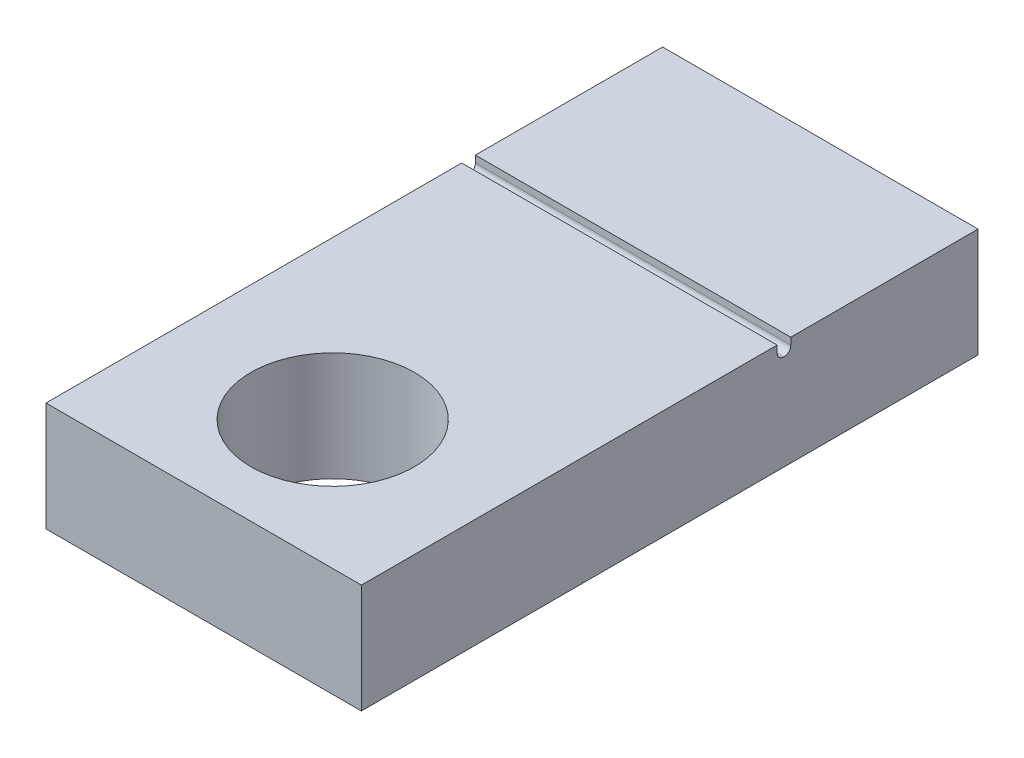
ISO-10303-21;
HEADER;
FILE_DESCRIPTION(('STEP AP214'),'2;1');
FILE_NAME('part.step','',(''),(''),'','','');
FILE_SCHEMA(('AUTOMOTIVE_DESIGN { 1 0 10303 214 1 1 1 1 }'));
ENDSEC;
DATA;
#1=APPLICATION_CONTEXT('core data for automotive mechanical design processes');
#2=APPLICATION_PROTOCOL_DEFINITION('international standard','automotive_design',2000,#1);
#3=PRODUCT_CONTEXT('',#1,'mechanical');
#4=PRODUCT('Part','Part','',(#3));
#5=PRODUCT_RELATED_PRODUCT_CATEGORY('part','',(#4));
#6=PRODUCT_DEFINITION_FORMATION('','',#4);
#7=PRODUCT_DEFINITION_CONTEXT('part definition',#1,'design');
#8=PRODUCT_DEFINITION('design','',#6,#7);
#9=PRODUCT_DEFINITION_SHAPE('','',#8);
#10=(LENGTH_UNIT() NAMED_UNIT(*) SI_UNIT(.MILLI.,.METRE.));
#11=(NAMED_UNIT(*) PLANE_ANGLE_UNIT() SI_UNIT($,.RADIAN.));
#12=(NAMED_UNIT(*) SI_UNIT($,.STERADIAN.) SOLID_ANGLE_UNIT());
#13=UNCERTAINTY_MEASURE_WITH_UNIT(LENGTH_MEASURE(1.E-05),#10,'distance_accuracy_value','');
#14=(GEOMETRIC_REPRESENTATION_CONTEXT(3) GLOBAL_UNCERTAINTY_ASSIGNED_CONTEXT((#13)) GLOBAL_UNIT_ASSIGNED_CONTEXT((#10,
#11,#12)) REPRESENTATION_CONTEXT('',''));
#15=CARTESIAN_POINT('',(0.,0.,0.));
#16=DIRECTION('',(0.,0.,1.));
#17=DIRECTION('',(1.,0.,0.));
#18=AXIS2_PLACEMENT_3D('',#15,#16,#17);
#19=CARTESIAN_POINT('',(0.,8.,0.));
#20=DIRECTION('',(0.,1.,0.));
#21=DIRECTION('',(0.,0.,1.));
#22=AXIS2_PLACEMENT_3D('',#19,#20,#21);
#23=PLANE('',#22);
#24=DIRECTION('',(1.,0.,0.));
#25=VECTOR('',#24,1.);
#26=CARTESIAN_POINT('',(0.,8.,-13.0361684561709));
#27=LINE('',#26,#25);
#28=CARTESIAN_POINT('',(-11.5687228073918,8.,-13.0361684561709));
#29=VERTEX_POINT('',#28);
#30=CARTESIAN_POINT('',(11.5687228073918,8.,-13.0361684561709));
#31=VERTEX_POINT('',#30);
#32=EDGE_CURVE('E117',#29,#31,#27,.T.);
#33=ORIENTED_EDGE('',*,*,#32,.F.);
#34=DIRECTION('',(0.,0.,1.));
#35=VECTOR('',#34,1.);
#36=CARTESIAN_POINT('',(-11.5687228073918,8.,0.));
#37=LINE('',#36,#35);
#38=CARTESIAN_POINT('',(-11.5687228073918,8.,17.4647043689874));
#39=VERTEX_POINT('',#38);
#40=EDGE_CURVE('E188',#29,#39,#37,.T.);
#41=ORIENTED_EDGE('',*,*,#40,.T.);
#42=DIRECTION('',(1.,0.,0.));
#43=VECTOR('',#42,1.);
#44=CARTESIAN_POINT('',(0.,8.,17.4647043689874));
#45=LINE('',#44,#43);
#46=CARTESIAN_POINT('',(11.5687228073918,8.,17.4647043689874));
#47=VERTEX_POINT('',#46);
#48=EDGE_CURVE('E136',#39,#47,#45,.T.);
#49=ORIENTED_EDGE('',*,*,#48,.T.);
#50=DIRECTION('',(0.,0.,1.));
#51=VECTOR('',#50,1.);
#52=CARTESIAN_POINT('',(11.5687228073918,8.,0.));
#53=LINE('',#52,#51);
#54=EDGE_CURVE('E130',#31,#47,#53,.T.);
#55=ORIENTED_EDGE('',*,*,#54,.F.);
#56=EDGE_LOOP('',(#33,#41,#49,#55));
#57=FACE_BOUND('',#56,.T.);
#58=CARTESIAN_POINT('',(0.,8.,8.00235768739895));
#59=DIRECTION('',(0.,1.,0.));
#60=DIRECTION('',(0.,0.,1.));
#61=AXIS2_PLACEMENT_3D('',#58,#59,#60);
#62=CIRCLE('',#61,5.99999999999993);
#63=CARTESIAN_POINT('',(0.,8.,14.0023576873989));
#64=VERTEX_POINT('',#63);
#65=EDGE_CURVE('E159',#64,#64,#62,.T.);
#66=ORIENTED_EDGE('',*,*,#65,.F.);
#67=EDGE_LOOP('',(#66));
#68=FACE_BOUND('',#67,.T.);
#69=ADVANCED_FACE('F46',(#57,#68),#23,.T.);
#70=CARTESIAN_POINT('',(-11.5687228073918,8.,0.));
#71=DIRECTION('',(1.,0.,0.));
#72=DIRECTION('',(0.,0.,-1.));
#73=AXIS2_PLACEMENT_3D('',#70,#71,#72);
#74=PLANE('',#73);
#75=ORIENTED_EDGE('',*,*,#40,.F.);
#76=DIRECTION('',(0.,-1.,0.));
#77=VECTOR('',#76,1.);
#78=CARTESIAN_POINT('',(-11.5687228073918,8.,-13.0361684561709));
#79=LINE('',#78,#77);
#80=CARTESIAN_POINT('',(-11.5687228073918,7.5,-13.0361684561709));
#81=VERTEX_POINT('',#80);
#82=EDGE_CURVE('E122',#29,#81,#79,.T.);
#83=ORIENTED_EDGE('',*,*,#82,.T.);
#84=CARTESIAN_POINT('',(-11.5687228073918,7.5,-13.5361684561709));
#85=DIRECTION('',(1.,0.,0.));
#86=DIRECTION('',(0.,0.,-1.));
#87=AXIS2_PLACEMENT_3D('',#84,#85,#86);
#88=CIRCLE('',#87,0.5);
#89=CARTESIAN_POINT('',(-11.5687228073918,7.,-13.5361684561709));
#90=VERTEX_POINT('',#89);
#91=EDGE_CURVE('E13',#81,#90,#88,.T.);
#92=ORIENTED_EDGE('',*,*,#91,.T.);
#93=CARTESIAN_POINT('',(-11.5687228073918,7.5,-13.5361684561709));
#94=DIRECTION('',(1.,0.,0.));
#95=DIRECTION('',(0.,0.,-1.));
#96=AXIS2_PLACEMENT_3D('',#93,#94,#95);
#97=CIRCLE('',#96,0.5);
#98=CARTESIAN_POINT('',(-11.5687228073918,7.5,-14.0361684561709));
#99=VERTEX_POINT('',#98);
#100=EDGE_CURVE('E171',#90,#99,#97,.T.);
#101=ORIENTED_EDGE('',*,*,#100,.T.);
#102=DIRECTION('',(0.,1.,0.));
#103=VECTOR('',#102,1.);
#104=CARTESIAN_POINT('',(-11.5687228073918,8.,-14.0361684561709));
#105=LINE('',#104,#103);
#106=CARTESIAN_POINT('',(-11.5687228073918,8.,-14.0361684561709));
#107=VERTEX_POINT('',#106);
#108=EDGE_CURVE('E176',#99,#107,#105,.T.);
#109=ORIENTED_EDGE('',*,*,#108,.T.);
#110=CARTESIAN_POINT('',(-11.5687228073918,8.,-27.7714433138588));
#111=VERTEX_POINT('',#110);
#112=EDGE_CURVE('E142',#111,#107,#37,.T.);
#113=ORIENTED_EDGE('',*,*,#112,.F.);
#114=DIRECTION('',(0.,-1.,0.));
#115=VECTOR('',#114,1.);
#116=CARTESIAN_POINT('',(-11.5687228073918,8.,-27.7714433138588));
#117=LINE('',#116,#115);
#118=CARTESIAN_POINT('',(-11.5687228073918,0.,-27.7714433138588));
#119=VERTEX_POINT('',#118);
#120=EDGE_CURVE('E197',#111,#119,#117,.T.);
#121=ORIENTED_EDGE('',*,*,#120,.T.);
#122=DIRECTION('',(0.,0.,1.));
#123=VECTOR('',#122,1.);
#124=CARTESIAN_POINT('',(-11.5687228073918,0.,0.));
#125=LINE('',#124,#123);
#126=CARTESIAN_POINT('',(-11.5687228073918,0.,17.4647043689874));
#127=VERTEX_POINT('',#126);
#128=EDGE_CURVE('E149',#119,#127,#125,.T.);
#129=ORIENTED_EDGE('',*,*,#128,.T.);
#130=DIRECTION('',(0.,-1.,0.));
#131=VECTOR('',#130,1.);
#132=CARTESIAN_POINT('',(-11.5687228073918,8.,17.4647043689874));
#133=LINE('',#132,#131);
#134=EDGE_CURVE('E161',#39,#127,#133,.T.);
#135=ORIENTED_EDGE('',*,*,#134,.F.);
#136=EDGE_LOOP('',(#75,#83,#92,#101,#109,#113,#121,#129,#135));
#137=FACE_BOUND('',#136,.T.);
#138=ADVANCED_FACE('F175',(#137),#74,.F.);
#139=CARTESIAN_POINT('',(0.,8.,17.4647043689874));
#140=DIRECTION('',(0.,0.,-1.));
#141=DIRECTION('',(-1.,0.,0.));
#142=AXIS2_PLACEMENT_3D('',#139,#140,#141);
#143=PLANE('',#142);
#144=DIRECTION('',(1.,0.,0.));
#145=VECTOR('',#144,1.);
#146=CARTESIAN_POINT('',(0.,0.,17.4647043689874));
#147=LINE('',#146,#145);
#148=CARTESIAN_POINT('',(11.5687228073918,0.,17.4647043689874));
#149=VERTEX_POINT('',#148);
#150=EDGE_CURVE('E153',#127,#149,#147,.T.);
#151=ORIENTED_EDGE('',*,*,#150,.T.);
#152=DIRECTION('',(0.,-1.,0.));
#153=VECTOR('',#152,1.);
#154=CARTESIAN_POINT('',(11.5687228073918,8.,17.4647043689874));
#155=LINE('',#154,#153);
#156=EDGE_CURVE('E141',#47,#149,#155,.T.);
#157=ORIENTED_EDGE('',*,*,#156,.F.);
#158=ORIENTED_EDGE('',*,*,#48,.F.);
#159=ORIENTED_EDGE('',*,*,#134,.T.);
#160=EDGE_LOOP('',(#151,#157,#158,#159));
#161=FACE_BOUND('',#160,.T.);
#162=ADVANCED_FACE('F207',(#161),#143,.F.);
#163=CARTESIAN_POINT('',(0.,8.,8.00235768739895));
#164=DIRECTION('',(0.,-1.,0.));
#165=DIRECTION('',(0.,0.,-1.));
#166=AXIS2_PLACEMENT_3D('',#163,#164,#165);
#167=CYLINDRICAL_SURFACE('',#166,5.99999999999993);
#168=ORIENTED_EDGE('',*,*,#65,.T.);
#169=EDGE_LOOP('',(#168));
#170=FACE_BOUND('',#169,.T.);
#171=CARTESIAN_POINT('',(0.,0.,8.00235768739895));
#172=DIRECTION('',(0.,1.,0.));
#173=DIRECTION('',(0.,0.,1.));
#174=AXIS2_PLACEMENT_3D('',#171,#172,#173);
#175=CIRCLE('',#174,5.99999999999993);
#176=CARTESIAN_POINT('',(0.,0.,14.0023576873989));
#177=VERTEX_POINT('',#176);
#178=EDGE_CURVE('E146',#177,#177,#175,.T.);
#179=ORIENTED_EDGE('',*,*,#178,.F.);
#180=EDGE_LOOP('',(#179));
#181=FACE_BOUND('',#180,.T.);
#182=ADVANCED_FACE('F224',(#170,#181),#167,.F.);
#183=CARTESIAN_POINT('',(11.5687228073918,8.,0.));
#184=DIRECTION('',(1.,0.,0.));
#185=DIRECTION('',(0.,0.,-1.));
#186=AXIS2_PLACEMENT_3D('',#183,#184,#185);
#187=PLANE('',#186);
#188=DIRECTION('',(0.,-1.,0.));
#189=VECTOR('',#188,1.);
#190=CARTESIAN_POINT('',(11.5687228073918,9.,-13.0361684561709));
#191=LINE('',#190,#189);
#192=CARTESIAN_POINT('',(11.5687228073918,7.5,-13.0361684561709));
#193=VERTEX_POINT('',#192);
#194=EDGE_CURVE('E120',#31,#193,#191,.T.);
#195=ORIENTED_EDGE('',*,*,#194,.F.);
#196=ORIENTED_EDGE('',*,*,#54,.T.);
#197=ORIENTED_EDGE('',*,*,#156,.T.);
#198=DIRECTION('',(0.,0.,1.));
#199=VECTOR('',#198,1.);
#200=CARTESIAN_POINT('',(11.5687228073918,0.,0.));
#201=LINE('',#200,#199);
#202=CARTESIAN_POINT('',(11.5687228073918,0.,-27.7714433138588));
#203=VERTEX_POINT('',#202);
#204=EDGE_CURVE('E156',#203,#149,#201,.T.);
#205=ORIENTED_EDGE('',*,*,#204,.F.);
#206=DIRECTION('',(0.,-1.,0.));
#207=VECTOR('',#206,1.);
#208=CARTESIAN_POINT('',(11.5687228073918,8.,-27.7714433138588));
#209=LINE('',#208,#207);
#210=CARTESIAN_POINT('',(11.5687228073918,8.,-27.7714433138588));
#211=VERTEX_POINT('',#210);
#212=EDGE_CURVE('E150',#211,#203,#209,.T.);
#213=ORIENTED_EDGE('',*,*,#212,.F.);
#214=CARTESIAN_POINT('',(11.5687228073918,8.,-14.0361684561709));
#215=VERTEX_POINT('',#214);
#216=EDGE_CURVE('E138',#211,#215,#53,.T.);
#217=ORIENTED_EDGE('',*,*,#216,.T.);
#218=DIRECTION('',(0.,1.,0.));
#219=VECTOR('',#218,1.);
#220=CARTESIAN_POINT('',(11.5687228073918,9.,-14.0361684561709));
#221=LINE('',#220,#219);
#222=CARTESIAN_POINT('',(11.5687228073918,7.5,-14.0361684561709));
#223=VERTEX_POINT('',#222);
#224=EDGE_CURVE('E132',#223,#215,#221,.T.);
#225=ORIENTED_EDGE('',*,*,#224,.F.);
#226=CARTESIAN_POINT('',(11.5687228073918,7.5,-13.5361684561709));
#227=DIRECTION('',(1.,0.,0.));
#228=DIRECTION('',(0.,0.,-1.));
#229=AXIS2_PLACEMENT_3D('',#226,#227,#228);
#230=CIRCLE('',#229,0.5);
#231=CARTESIAN_POINT('',(11.5687228073918,7.,-13.5361684561709));
#232=VERTEX_POINT('',#231);
#233=EDGE_CURVE('E68',#223,#232,#230,.F.);
#234=ORIENTED_EDGE('',*,*,#233,.T.);
#235=CARTESIAN_POINT('',(11.5687228073918,7.5,-13.5361684561709));
#236=DIRECTION('',(1.,0.,0.));
#237=DIRECTION('',(0.,0.,-1.));
#238=AXIS2_PLACEMENT_3D('',#235,#236,#237);
#239=CIRCLE('',#238,0.5);
#240=EDGE_CURVE('E55',#232,#193,#239,.F.);
#241=ORIENTED_EDGE('',*,*,#240,.T.);
#242=EDGE_LOOP('',(#195,#196,#197,#205,#213,#217,#225,#234,#241));
#243=FACE_BOUND('',#242,.T.);
#244=ADVANCED_FACE('F129',(#243),#187,.T.);
#245=DIRECTION('',(-1.,0.,0.));
#246=VECTOR('',#245,1.);
#247=CARTESIAN_POINT('',(0.,8.,-14.0361684561709));
#248=LINE('',#247,#246);
#249=EDGE_CURVE('E127',#215,#107,#248,.T.);
#250=ORIENTED_EDGE('',*,*,#249,.F.);
#251=ORIENTED_EDGE('',*,*,#216,.F.);
#252=DIRECTION('',(1.,0.,0.));
#253=VECTOR('',#252,1.);
#254=CARTESIAN_POINT('',(-11.5687228073918,8.,-27.7714433138588));
#255=LINE('',#254,#253);
#256=EDGE_CURVE('E192',#111,#211,#255,.T.);
#257=ORIENTED_EDGE('',*,*,#256,.F.);
#258=ORIENTED_EDGE('',*,*,#112,.T.);
#259=EDGE_LOOP('',(#250,#251,#257,#258));
#260=FACE_BOUND('',#259,.T.);
#261=ADVANCED_FACE('F215',(#260),#23,.T.);
#262=CARTESIAN_POINT('',(0.,0.,0.));
#263=DIRECTION('',(0.,1.,0.));
#264=DIRECTION('',(0.,0.,1.));
#265=AXIS2_PLACEMENT_3D('',#262,#263,#264);
#266=PLANE('',#265);
#267=ORIENTED_EDGE('',*,*,#178,.T.);
#268=EDGE_LOOP('',(#267));
#269=FACE_BOUND('',#268,.T.);
#270=ORIENTED_EDGE('',*,*,#128,.F.);
#271=DIRECTION('',(1.,0.,0.));
#272=VECTOR('',#271,1.);
#273=CARTESIAN_POINT('',(-11.5687228073918,0.,-27.7714433138588));
#274=LINE('',#273,#272);
#275=EDGE_CURVE('E189',#119,#203,#274,.T.);
#276=ORIENTED_EDGE('',*,*,#275,.T.);
#277=ORIENTED_EDGE('',*,*,#204,.T.);
#278=ORIENTED_EDGE('',*,*,#150,.F.);
#279=EDGE_LOOP('',(#270,#276,#277,#278));
#280=FACE_BOUND('',#279,.T.);
#281=ADVANCED_FACE('F211',(#269,#280),#266,.F.);
#282=CARTESIAN_POINT('',(-11.5687228073918,8.,-27.7714433138588));
#283=DIRECTION('',(0.,0.,-1.));
#284=DIRECTION('',(-1.,0.,0.));
#285=AXIS2_PLACEMENT_3D('',#282,#283,#284);
#286=PLANE('',#285);
#287=ORIENTED_EDGE('',*,*,#275,.F.);
#288=ORIENTED_EDGE('',*,*,#120,.F.);
#289=ORIENTED_EDGE('',*,*,#256,.T.);
#290=ORIENTED_EDGE('',*,*,#212,.T.);
#291=EDGE_LOOP('',(#287,#288,#289,#290));
#292=FACE_BOUND('',#291,.T.);
#293=ADVANCED_FACE('F214',(#292),#286,.T.);
#294=CARTESIAN_POINT('',(-48.4312771926082,9.,-13.0361684561709));
#295=DIRECTION('',(0.,0.,1.));
#296=DIRECTION('',(1.,0.,0.));
#297=AXIS2_PLACEMENT_3D('',#294,#295,#296);
#298=PLANE('',#297);
#299=ORIENTED_EDGE('',*,*,#194,.T.);
#300=DIRECTION('',(1.,0.,0.));
#301=VECTOR('',#300,1.);
#302=CARTESIAN_POINT('',(-11.5687228073918,7.5,-13.0361684561709));
#303=LINE('',#302,#301);
#304=EDGE_CURVE('E168',#193,#81,#303,.F.);
#305=ORIENTED_EDGE('',*,*,#304,.T.);
#306=ORIENTED_EDGE('',*,*,#82,.F.);
#307=ORIENTED_EDGE('',*,*,#32,.T.);
#308=EDGE_LOOP('',(#299,#305,#306,#307));
#309=FACE_BOUND('',#308,.T.);
#310=ADVANCED_FACE('F119',(#309),#298,.F.);
#311=CARTESIAN_POINT('',(-48.4312771926082,9.,-14.0361684561709));
#312=DIRECTION('',(0.,0.,-1.));
#313=DIRECTION('',(-1.,0.,0.));
#314=AXIS2_PLACEMENT_3D('',#311,#312,#313);
#315=PLANE('',#314);
#316=ORIENTED_EDGE('',*,*,#108,.F.);
#317=DIRECTION('',(1.,0.,0.));
#318=VECTOR('',#317,1.);
#319=CARTESIAN_POINT('',(11.5687228073918,7.5,-14.0361684561709));
#320=LINE('',#319,#318);
#321=EDGE_CURVE('E126',#99,#223,#320,.T.);
#322=ORIENTED_EDGE('',*,*,#321,.T.);
#323=ORIENTED_EDGE('',*,*,#224,.T.);
#324=ORIENTED_EDGE('',*,*,#249,.T.);
#325=EDGE_LOOP('',(#316,#322,#323,#324));
#326=FACE_BOUND('',#325,.T.);
#327=ADVANCED_FACE('F181',(#326),#315,.F.);
#328=CARTESIAN_POINT('',(-48.4312771926082,7.5,-13.5361684561709));
#329=DIRECTION('',(-1.,0.,0.));
#330=DIRECTION('',(0.,0.,1.));
#331=AXIS2_PLACEMENT_3D('',#328,#329,#330);
#332=CYLINDRICAL_SURFACE('',#331,0.5);
#333=DIRECTION('',(1.,0.,0.));
#334=VECTOR('',#333,1.);
#335=CARTESIAN_POINT('',(11.5687228073918,7.,-13.5361684561709));
#336=LINE('',#335,#334);
#337=EDGE_CURVE('E50',#90,#232,#336,.T.);
#338=ORIENTED_EDGE('',*,*,#337,.F.);
#339=ORIENTED_EDGE('',*,*,#91,.F.);
#340=ORIENTED_EDGE('',*,*,#304,.F.);
#341=ORIENTED_EDGE('',*,*,#240,.F.);
#342=EDGE_LOOP('',(#338,#339,#340,#341));
#343=FACE_BOUND('',#342,.T.);
#344=ADVANCED_FACE('F48',(#343),#332,.F.);
#345=CARTESIAN_POINT('',(-48.4312771926082,7.5,-13.5361684561709));
#346=DIRECTION('',(-1.,0.,0.));
#347=DIRECTION('',(0.,0.,1.));
#348=AXIS2_PLACEMENT_3D('',#345,#346,#347);
#349=CYLINDRICAL_SURFACE('',#348,0.5);
#350=ORIENTED_EDGE('',*,*,#100,.F.);
#351=ORIENTED_EDGE('',*,*,#337,.T.);
#352=ORIENTED_EDGE('',*,*,#233,.F.);
#353=ORIENTED_EDGE('',*,*,#321,.F.);
#354=EDGE_LOOP('',(#350,#351,#352,#353));
#355=FACE_BOUND('',#354,.T.);
#356=ADVANCED_FACE('F185',(#355),#349,.F.);
#357=CLOSED_SHELL('',(#69,#138,#162,#182,#244,#261,#281,#293,#310,#327,#344,#356));
#358=MANIFOLD_SOLID_BREP('B2',#357);
#359=ADVANCED_BREP_SHAPE_REPRESENTATION('',(#18,#358),#14);
#360=SHAPE_DEFINITION_REPRESENTATION(#9,#359);
ENDSEC;
END-ISO-10303-21;
